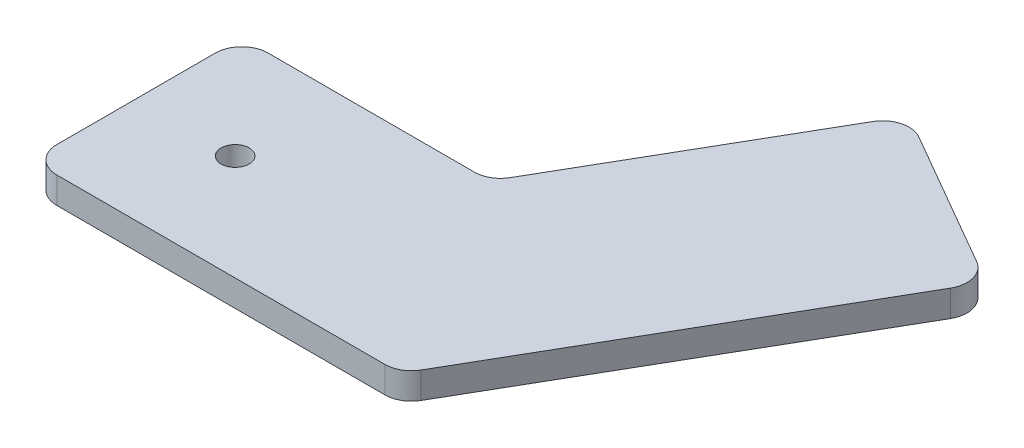
ISO-10303-21;
HEADER;
FILE_DESCRIPTION(('STEP AP214'),'2;1');
FILE_NAME('part.step','',(''),(''),'','','');
FILE_SCHEMA(('AUTOMOTIVE_DESIGN { 1 0 10303 214 1 1 1 1 }'));
ENDSEC;
DATA;
#1=APPLICATION_CONTEXT('core data for automotive mechanical design processes');
#2=APPLICATION_PROTOCOL_DEFINITION('international standard','automotive_design',2000,#1);
#3=PRODUCT_CONTEXT('',#1,'mechanical');
#4=PRODUCT('Part','Part','',(#3));
#5=PRODUCT_RELATED_PRODUCT_CATEGORY('part','',(#4));
#6=PRODUCT_DEFINITION_FORMATION('','',#4);
#7=PRODUCT_DEFINITION_CONTEXT('part definition',#1,'design');
#8=PRODUCT_DEFINITION('design','',#6,#7);
#9=PRODUCT_DEFINITION_SHAPE('','',#8);
#10=(LENGTH_UNIT() NAMED_UNIT(*) SI_UNIT(.MILLI.,.METRE.));
#11=(NAMED_UNIT(*) PLANE_ANGLE_UNIT() SI_UNIT($,.RADIAN.));
#12=(NAMED_UNIT(*) SI_UNIT($,.STERADIAN.) SOLID_ANGLE_UNIT());
#13=UNCERTAINTY_MEASURE_WITH_UNIT(LENGTH_MEASURE(1.E-05),#10,'distance_accuracy_value','');
#14=(GEOMETRIC_REPRESENTATION_CONTEXT(3) GLOBAL_UNCERTAINTY_ASSIGNED_CONTEXT((#13)) GLOBAL_UNIT_ASSIGNED_CONTEXT((#10,
#11,#12)) REPRESENTATION_CONTEXT('',''));
#15=CARTESIAN_POINT('',(0.,0.,0.));
#16=DIRECTION('',(0.,0.,1.));
#17=DIRECTION('',(1.,0.,0.));
#18=AXIS2_PLACEMENT_3D('',#15,#16,#17);
#19=CARTESIAN_POINT('',(0.,6.35,0.));
#20=DIRECTION('',(0.,1.,0.));
#21=DIRECTION('',(0.,0.,1.));
#22=AXIS2_PLACEMENT_3D('',#19,#20,#21);
#23=PLANE('',#22);
#24=CARTESIAN_POINT('',(-65.0875,6.35,-25.4));
#25=DIRECTION('',(0.,1.,0.));
#26=DIRECTION('',(0.,0.,1.));
#27=AXIS2_PLACEMENT_3D('',#24,#25,#26);
#28=CIRCLE('',#27,3.3655);
#29=CARTESIAN_POINT('',(-65.0875,6.35,-22.0345));
#30=VERTEX_POINT('',#29);
#31=EDGE_CURVE('E167',#30,#30,#28,.F.);
#32=ORIENTED_EDGE('',*,*,#31,.T.);
#33=EDGE_LOOP('',(#32));
#34=FACE_BOUND('',#33,.T.);
#35=DIRECTION('',(-1.,0.,0.));
#36=VECTOR('',#35,1.);
#37=CARTESIAN_POINT('',(-29.3293936748266,6.35,-50.8));
#38=LINE('',#37,#36);
#39=CARTESIAN_POINT('',(-82.55,6.35,-50.8));
#40=VERTEX_POINT('',#39);
#41=CARTESIAN_POINT('',(-32.9955678841958,6.35,-50.8));
#42=VERTEX_POINT('',#41);
#43=EDGE_CURVE('E117',#40,#42,#38,.F.);
#44=ORIENTED_EDGE('',*,*,#43,.F.);
#45=CARTESIAN_POINT('',(-82.55,6.35,-44.45));
#46=DIRECTION('',(0.,-1.,0.));
#47=DIRECTION('',(0.,0.,-1.));
#48=AXIS2_PLACEMENT_3D('',#45,#46,#47);
#49=CIRCLE('',#48,6.35);
#50=CARTESIAN_POINT('',(-88.9,6.35,-44.45));
#51=VERTEX_POINT('',#50);
#52=EDGE_CURVE('E20',#51,#40,#49,.T.);
#53=ORIENTED_EDGE('',*,*,#52,.F.);
#54=DIRECTION('',(0.,0.,1.));
#55=VECTOR('',#54,1.);
#56=CARTESIAN_POINT('',(-88.9,6.35,-50.8));
#57=LINE('',#56,#55);
#58=CARTESIAN_POINT('',(-88.9,6.35,-6.35));
#59=VERTEX_POINT('',#58);
#60=EDGE_CURVE('E103',#59,#51,#57,.F.);
#61=ORIENTED_EDGE('',*,*,#60,.F.);
#62=CARTESIAN_POINT('',(-82.55,6.35,-6.35));
#63=DIRECTION('',(0.,-1.,0.));
#64=DIRECTION('',(0.,0.,-1.));
#65=AXIS2_PLACEMENT_3D('',#62,#63,#64);
#66=CIRCLE('',#65,6.35);
#67=CARTESIAN_POINT('',(-82.55,6.35,0.));
#68=VERTEX_POINT('',#67);
#69=EDGE_CURVE('E124',#68,#59,#66,.T.);
#70=ORIENTED_EDGE('',*,*,#69,.F.);
#71=DIRECTION('',(1.,0.,0.));
#72=VECTOR('',#71,1.);
#73=CARTESIAN_POINT('',(-88.9,6.35,0.));
#74=LINE('',#73,#72);
#75=CARTESIAN_POINT('',(-3.66617420935396,6.35,0.));
#76=VERTEX_POINT('',#75);
#77=EDGE_CURVE('E143',#76,#68,#74,.F.);
#78=ORIENTED_EDGE('',*,*,#77,.F.);
#79=CARTESIAN_POINT('',(-3.66617420935396,6.35,-6.35));
#80=DIRECTION('',(0.,-1.,0.));
#81=DIRECTION('',(0.,0.,-1.));
#82=AXIS2_PLACEMENT_3D('',#79,#80,#81);
#83=CIRCLE('',#82,6.35);
#84=CARTESIAN_POINT('',(1.83308710467707,6.35,-3.17499999999987));
#85=VERTEX_POINT('',#84);
#86=EDGE_CURVE('E177',#85,#76,#83,.T.);
#87=ORIENTED_EDGE('',*,*,#86,.F.);
#88=DIRECTION('',(0.500000000000017,0.,-0.866025403784429));
#89=VECTOR('',#88,1.);
#90=CARTESIAN_POINT('',(0.,6.35,0.));
#91=LINE('',#90,#89);
#92=CARTESIAN_POINT('',(48.4187500000012,6.35,-83.8637350389712));
#93=VERTEX_POINT('',#92);
#94=EDGE_CURVE('E139',#93,#85,#91,.F.);
#95=ORIENTED_EDGE('',*,*,#94,.F.);
#96=CARTESIAN_POINT('',(42.9194886859716,6.35,-87.0387350389712));
#97=DIRECTION('',(0.,-1.,0.));
#98=DIRECTION('',(0.,0.,-1.));
#99=AXIS2_PLACEMENT_3D('',#96,#97,#98);
#100=CIRCLE('',#99,6.35);
#101=CARTESIAN_POINT('',(46.0944886859704,6.35,-92.5379963529988));
#102=VERTEX_POINT('',#101);
#103=EDGE_CURVE('E175',#102,#93,#100,.T.);
#104=ORIENTED_EDGE('',*,*,#103,.F.);
#105=DIRECTION('',(-0.866025403784429,0.,-0.500000000000017));
#106=VECTOR('',#105,1.);
#107=CARTESIAN_POINT('',(51.59375,6.35,-89.3629963529996));
#108=LINE('',#107,#106);
#109=CARTESIAN_POINT('',(13.0989208017813,6.35,-111.587996353002));
#110=VERTEX_POINT('',#109);
#111=EDGE_CURVE('E135',#110,#102,#108,.F.);
#112=ORIENTED_EDGE('',*,*,#111,.F.);
#113=CARTESIAN_POINT('',(9.92392080178088,6.35,-106.088735038971));
#114=DIRECTION('',(0.,-1.,0.));
#115=DIRECTION('',(0.,0.,-1.));
#116=AXIS2_PLACEMENT_3D('',#113,#114,#115);
#117=CIRCLE('',#116,6.35);
#118=CARTESIAN_POINT('',(4.42465948775104,6.35,-109.263735038971));
#119=VERTEX_POINT('',#118);
#120=EDGE_CURVE('E173',#119,#110,#117,.T.);
#121=ORIENTED_EDGE('',*,*,#120,.F.);
#122=DIRECTION('',(-0.500000000000017,0.,0.866025403784429));
#123=VECTOR('',#122,1.);
#124=CARTESIAN_POINT('',(7.59965948774994,6.35,-114.762996353));
#125=LINE('',#124,#123);
#126=CARTESIAN_POINT('',(-27.4963065701523,6.35,-53.9750000000121));
#127=VERTEX_POINT('',#126);
#128=EDGE_CURVE('E131',#127,#119,#125,.F.);
#129=ORIENTED_EDGE('',*,*,#128,.F.);
#130=CARTESIAN_POINT('',(-32.9955678841958,6.35,-57.15));
#131=DIRECTION('',(0.,1.,0.));
#132=DIRECTION('',(0.,0.,1.));
#133=AXIS2_PLACEMENT_3D('',#130,#131,#132);
#134=CIRCLE('',#133,6.35);
#135=EDGE_CURVE('E130',#127,#42,#134,.F.);
#136=ORIENTED_EDGE('',*,*,#135,.T.);
#137=EDGE_LOOP('',(#44,#53,#61,#70,#78,#87,#95,#104,#112,#121,#129,#136));
#138=FACE_BOUND('',#137,.T.);
#139=ADVANCED_FACE('F17',(#34,#138),#23,.T.);
#140=CARTESIAN_POINT('',(-82.55,14.62786,-44.45));
#141=DIRECTION('',(0.,-1.,0.));
#142=DIRECTION('',(0.,0.,-1.));
#143=AXIS2_PLACEMENT_3D('',#140,#141,#142);
#144=CYLINDRICAL_SURFACE('',#143,6.35);
#145=DIRECTION('',(0.,1.,0.));
#146=VECTOR('',#145,1.);
#147=CARTESIAN_POINT('',(-82.55,0.,-50.8));
#148=LINE('',#147,#146);
#149=CARTESIAN_POINT('',(-82.55,0.,-50.8));
#150=VERTEX_POINT('',#149);
#151=EDGE_CURVE('E170',#150,#40,#148,.T.);
#152=ORIENTED_EDGE('',*,*,#151,.F.);
#153=CARTESIAN_POINT('',(-82.55,0.,-44.45));
#154=DIRECTION('',(0.,-1.,0.));
#155=DIRECTION('',(0.,0.,-1.));
#156=AXIS2_PLACEMENT_3D('',#153,#154,#155);
#157=CIRCLE('',#156,6.35);
#158=CARTESIAN_POINT('',(-88.9,0.,-44.45));
#159=VERTEX_POINT('',#158);
#160=EDGE_CURVE('E123',#150,#159,#157,.F.);
#161=ORIENTED_EDGE('',*,*,#160,.T.);
#162=DIRECTION('',(0.,1.,0.));
#163=VECTOR('',#162,1.);
#164=CARTESIAN_POINT('',(-88.9,0.,-44.45));
#165=LINE('',#164,#163);
#166=EDGE_CURVE('E108',#51,#159,#165,.F.);
#167=ORIENTED_EDGE('',*,*,#166,.F.);
#168=ORIENTED_EDGE('',*,*,#52,.T.);
#169=EDGE_LOOP('',(#152,#161,#167,#168));
#170=FACE_BOUND('',#169,.T.);
#171=ADVANCED_FACE('F122',(#170),#144,.T.);
#172=CARTESIAN_POINT('',(-88.9,0.,-50.8));
#173=DIRECTION('',(-1.,0.,0.));
#174=DIRECTION('',(0.,0.,1.));
#175=AXIS2_PLACEMENT_3D('',#172,#173,#174);
#176=PLANE('',#175);
#177=ORIENTED_EDGE('',*,*,#60,.T.);
#178=ORIENTED_EDGE('',*,*,#166,.T.);
#179=DIRECTION('',(0.,0.,1.));
#180=VECTOR('',#179,1.);
#181=CARTESIAN_POINT('',(-88.9,0.,0.));
#182=LINE('',#181,#180);
#183=CARTESIAN_POINT('',(-88.9,0.,-6.35));
#184=VERTEX_POINT('',#183);
#185=EDGE_CURVE('E165',#159,#184,#182,.T.);
#186=ORIENTED_EDGE('',*,*,#185,.T.);
#187=DIRECTION('',(0.,-1.,0.));
#188=VECTOR('',#187,1.);
#189=CARTESIAN_POINT('',(-88.9,14.62786,-6.35));
#190=LINE('',#189,#188);
#191=EDGE_CURVE('E110',#59,#184,#190,.T.);
#192=ORIENTED_EDGE('',*,*,#191,.F.);
#193=EDGE_LOOP('',(#177,#178,#186,#192));
#194=FACE_BOUND('',#193,.T.);
#195=ADVANCED_FACE('F105',(#194),#176,.T.);
#196=CARTESIAN_POINT('',(-82.55,14.62786,-6.35));
#197=DIRECTION('',(0.,-1.,0.));
#198=DIRECTION('',(0.,0.,-1.));
#199=AXIS2_PLACEMENT_3D('',#196,#197,#198);
#200=CYLINDRICAL_SURFACE('',#199,6.35);
#201=ORIENTED_EDGE('',*,*,#191,.T.);
#202=CARTESIAN_POINT('',(-82.55,0.,-6.35));
#203=DIRECTION('',(0.,-1.,0.));
#204=DIRECTION('',(0.,0.,-1.));
#205=AXIS2_PLACEMENT_3D('',#202,#203,#204);
#206=CIRCLE('',#205,6.35);
#207=CARTESIAN_POINT('',(-82.55,0.,0.));
#208=VERTEX_POINT('',#207);
#209=EDGE_CURVE('E162',#184,#208,#206,.F.);
#210=ORIENTED_EDGE('',*,*,#209,.T.);
#211=DIRECTION('',(0.,1.,0.));
#212=VECTOR('',#211,1.);
#213=CARTESIAN_POINT('',(-82.55,0.,0.));
#214=LINE('',#213,#212);
#215=EDGE_CURVE('E144',#68,#208,#214,.F.);
#216=ORIENTED_EDGE('',*,*,#215,.F.);
#217=ORIENTED_EDGE('',*,*,#69,.T.);
#218=EDGE_LOOP('',(#201,#210,#216,#217));
#219=FACE_BOUND('',#218,.T.);
#220=ADVANCED_FACE('F241',(#219),#200,.T.);
#221=CARTESIAN_POINT('',(-88.9,0.,0.));
#222=DIRECTION('',(0.,0.,1.));
#223=DIRECTION('',(1.,0.,0.));
#224=AXIS2_PLACEMENT_3D('',#221,#222,#223);
#225=PLANE('',#224);
#226=ORIENTED_EDGE('',*,*,#77,.T.);
#227=ORIENTED_EDGE('',*,*,#215,.T.);
#228=DIRECTION('',(1.,0.,0.));
#229=VECTOR('',#228,1.);
#230=CARTESIAN_POINT('',(0.,0.,0.));
#231=LINE('',#230,#229);
#232=CARTESIAN_POINT('',(-3.66617420935396,0.,0.));
#233=VERTEX_POINT('',#232);
#234=EDGE_CURVE('E161',#208,#233,#231,.T.);
#235=ORIENTED_EDGE('',*,*,#234,.T.);
#236=DIRECTION('',(0.,-1.,0.));
#237=VECTOR('',#236,1.);
#238=CARTESIAN_POINT('',(-3.66617420935396,14.62786,0.));
#239=LINE('',#238,#237);
#240=EDGE_CURVE('E142',#76,#233,#239,.T.);
#241=ORIENTED_EDGE('',*,*,#240,.F.);
#242=EDGE_LOOP('',(#226,#227,#235,#241));
#243=FACE_BOUND('',#242,.T.);
#244=ADVANCED_FACE('F238',(#243),#225,.T.);
#245=CARTESIAN_POINT('',(-3.66617420935396,14.62786,-6.35));
#246=DIRECTION('',(0.,-1.,0.));
#247=DIRECTION('',(0.,0.,-1.));
#248=AXIS2_PLACEMENT_3D('',#245,#246,#247);
#249=CYLINDRICAL_SURFACE('',#248,6.35);
#250=ORIENTED_EDGE('',*,*,#240,.T.);
#251=CARTESIAN_POINT('',(-3.66617420935396,0.,-6.35));
#252=DIRECTION('',(0.,-1.,0.));
#253=DIRECTION('',(0.,0.,-1.));
#254=AXIS2_PLACEMENT_3D('',#251,#252,#253);
#255=CIRCLE('',#254,6.35);
#256=CARTESIAN_POINT('',(1.83308710467728,0.,-3.17499999999976));
#257=VERTEX_POINT('',#256);
#258=EDGE_CURVE('E158',#233,#257,#255,.F.);
#259=ORIENTED_EDGE('',*,*,#258,.T.);
#260=DIRECTION('',(0.,1.,0.));
#261=VECTOR('',#260,1.);
#262=CARTESIAN_POINT('',(1.83308710467704,0.,-3.17499999999982));
#263=LINE('',#262,#261);
#264=EDGE_CURVE('E141',#85,#257,#263,.F.);
#265=ORIENTED_EDGE('',*,*,#264,.F.);
#266=ORIENTED_EDGE('',*,*,#86,.T.);
#267=EDGE_LOOP('',(#250,#259,#265,#266));
#268=FACE_BOUND('',#267,.T.);
#269=ADVANCED_FACE('F236',(#268),#249,.T.);
#270=CARTESIAN_POINT('',(0.,0.,0.));
#271=DIRECTION('',(0.866025403784429,0.,0.500000000000017));
#272=DIRECTION('',(0.500000000000017,0.,-0.866025403784429));
#273=AXIS2_PLACEMENT_3D('',#270,#271,#272);
#274=PLANE('',#273);
#275=ORIENTED_EDGE('',*,*,#94,.T.);
#276=ORIENTED_EDGE('',*,*,#264,.T.);
#277=DIRECTION('',(0.500000000000015,0.,-0.86602540378443));
#278=VECTOR('',#277,1.);
#279=CARTESIAN_POINT('',(1.83308710467622,0.,-3.17499999999746));
#280=LINE('',#279,#278);
#281=CARTESIAN_POINT('',(48.4187500000014,0.,-83.8637350389712));
#282=VERTEX_POINT('',#281);
#283=EDGE_CURVE('E157',#257,#282,#280,.T.);
#284=ORIENTED_EDGE('',*,*,#283,.T.);
#285=DIRECTION('',(0.,-1.,0.));
#286=VECTOR('',#285,1.);
#287=CARTESIAN_POINT('',(48.4187500000021,14.62786,-83.86373503897));
#288=LINE('',#287,#286);
#289=EDGE_CURVE('E138',#93,#282,#288,.T.);
#290=ORIENTED_EDGE('',*,*,#289,.F.);
#291=EDGE_LOOP('',(#275,#276,#284,#290));
#292=FACE_BOUND('',#291,.T.);
#293=ADVANCED_FACE('F234',(#292),#274,.T.);
#294=CARTESIAN_POINT('',(42.9194886859716,14.62786,-87.0387350389712));
#295=DIRECTION('',(0.,-1.,0.));
#296=DIRECTION('',(0.,0.,-1.));
#297=AXIS2_PLACEMENT_3D('',#294,#295,#296);
#298=CYLINDRICAL_SURFACE('',#297,6.35);
#299=ORIENTED_EDGE('',*,*,#289,.T.);
#300=CARTESIAN_POINT('',(42.9194886859716,0.,-87.0387350389712));
#301=DIRECTION('',(0.,-1.,0.));
#302=DIRECTION('',(0.,0.,-1.));
#303=AXIS2_PLACEMENT_3D('',#300,#301,#302);
#304=CIRCLE('',#303,6.35);
#305=CARTESIAN_POINT('',(46.0944886859729,0.,-92.5379963530054));
#306=VERTEX_POINT('',#305);
#307=EDGE_CURVE('E154',#282,#306,#304,.F.);
#308=ORIENTED_EDGE('',*,*,#307,.T.);
#309=DIRECTION('',(0.,1.,0.));
#310=VECTOR('',#309,1.);
#311=CARTESIAN_POINT('',(46.094488685971,0.,-92.5379963529985));
#312=LINE('',#311,#310);
#313=EDGE_CURVE('E137',#102,#306,#312,.F.);
#314=ORIENTED_EDGE('',*,*,#313,.F.);
#315=ORIENTED_EDGE('',*,*,#103,.T.);
#316=EDGE_LOOP('',(#299,#308,#314,#315));
#317=FACE_BOUND('',#316,.T.);
#318=ADVANCED_FACE('F230',(#317),#298,.T.);
#319=CARTESIAN_POINT('',(51.59375,0.,-89.3629963529996));
#320=DIRECTION('',(0.500000000000017,0.,-0.866025403784429));
#321=DIRECTION('',(-0.866025403784429,0.,-0.500000000000017));
#322=AXIS2_PLACEMENT_3D('',#319,#320,#321);
#323=PLANE('',#322);
#324=DIRECTION('',(-0.866025403784612,0.,-0.499999999999699));
#325=VECTOR('',#324,1.);
#326=CARTESIAN_POINT('',(46.094488685997,0.,-92.5379963529996));
#327=LINE('',#326,#325);
#328=CARTESIAN_POINT('',(13.0989208017802,0.,-111.587996353002));
#329=VERTEX_POINT('',#328);
#330=EDGE_CURVE('E153',#306,#329,#327,.T.);
#331=ORIENTED_EDGE('',*,*,#330,.T.);
#332=DIRECTION('',(0.,-1.,0.));
#333=VECTOR('',#332,1.);
#334=CARTESIAN_POINT('',(13.0989208017821,14.62786,-111.587996353002));
#335=LINE('',#334,#333);
#336=EDGE_CURVE('E134',#110,#329,#335,.T.);
#337=ORIENTED_EDGE('',*,*,#336,.F.);
#338=ORIENTED_EDGE('',*,*,#111,.T.);
#339=ORIENTED_EDGE('',*,*,#313,.T.);
#340=EDGE_LOOP('',(#331,#337,#338,#339));
#341=FACE_BOUND('',#340,.T.);
#342=ADVANCED_FACE('F224',(#341),#323,.T.);
#343=CARTESIAN_POINT('',(9.92392080178088,14.62786,-106.088735038971));
#344=DIRECTION('',(0.,-1.,0.));
#345=DIRECTION('',(0.,0.,-1.));
#346=AXIS2_PLACEMENT_3D('',#343,#344,#345);
#347=CYLINDRICAL_SURFACE('',#346,6.35);
#348=ORIENTED_EDGE('',*,*,#336,.T.);
#349=CARTESIAN_POINT('',(9.92392080178088,0.,-106.088735038971));
#350=DIRECTION('',(0.,-1.,0.));
#351=DIRECTION('',(0.,0.,-1.));
#352=AXIS2_PLACEMENT_3D('',#349,#350,#351);
#353=CIRCLE('',#352,6.35);
#354=CARTESIAN_POINT('',(4.42465948775051,0.,-109.263735038971));
#355=VERTEX_POINT('',#354);
#356=EDGE_CURVE('E150',#329,#355,#353,.F.);
#357=ORIENTED_EDGE('',*,*,#356,.T.);
#358=DIRECTION('',(0.,1.,0.));
#359=VECTOR('',#358,1.);
#360=CARTESIAN_POINT('',(4.42465948775104,0.,-109.263735038971));
#361=LINE('',#360,#359);
#362=EDGE_CURVE('E133',#119,#355,#361,.F.);
#363=ORIENTED_EDGE('',*,*,#362,.F.);
#364=ORIENTED_EDGE('',*,*,#120,.T.);
#365=EDGE_LOOP('',(#348,#357,#363,#364));
#366=FACE_BOUND('',#365,.T.);
#367=ADVANCED_FACE('F220',(#366),#347,.T.);
#368=CARTESIAN_POINT('',(7.59965948774994,0.,-114.762996353));
#369=DIRECTION('',(-0.866025403784429,0.,-0.500000000000017));
#370=DIRECTION('',(-0.500000000000017,0.,0.866025403784429));
#371=AXIS2_PLACEMENT_3D('',#368,#369,#370);
#372=PLANE('',#371);
#373=ORIENTED_EDGE('',*,*,#128,.T.);
#374=ORIENTED_EDGE('',*,*,#362,.T.);
#375=DIRECTION('',(-0.500000000000032,0.,0.86602540378442));
#376=VECTOR('',#375,1.);
#377=CARTESIAN_POINT('',(4.42465948774994,0.,-109.263735038971));
#378=LINE('',#377,#376);
#379=CARTESIAN_POINT('',(-27.4963065701534,0.,-53.9750000000126));
#380=VERTEX_POINT('',#379);
#381=EDGE_CURVE('E149',#355,#380,#378,.T.);
#382=ORIENTED_EDGE('',*,*,#381,.T.);
#383=DIRECTION('',(0.,1.,0.));
#384=VECTOR('',#383,1.);
#385=CARTESIAN_POINT('',(-27.496306570148,-8.27786,-53.9750000000288));
#386=LINE('',#385,#384);
#387=EDGE_CURVE('E172',#380,#127,#386,.T.);
#388=ORIENTED_EDGE('',*,*,#387,.T.);
#389=EDGE_LOOP('',(#373,#374,#382,#388));
#390=FACE_BOUND('',#389,.T.);
#391=ADVANCED_FACE('F214',(#390),#372,.T.);
#392=CARTESIAN_POINT('',(-32.9955678841958,-8.27786,-57.15));
#393=DIRECTION('',(0.,1.,0.));
#394=DIRECTION('',(0.,0.,1.));
#395=AXIS2_PLACEMENT_3D('',#392,#393,#394);
#396=CYLINDRICAL_SURFACE('',#395,6.35);
#397=ORIENTED_EDGE('',*,*,#387,.F.);
#398=CARTESIAN_POINT('',(-32.9955678841958,0.,-57.15));
#399=DIRECTION('',(0.,1.,0.));
#400=DIRECTION('',(0.,0.,1.));
#401=AXIS2_PLACEMENT_3D('',#398,#399,#400);
#402=CIRCLE('',#401,6.35);
#403=CARTESIAN_POINT('',(-32.9955678841958,0.,-50.8));
#404=VERTEX_POINT('',#403);
#405=EDGE_CURVE('E146',#380,#404,#402,.F.);
#406=ORIENTED_EDGE('',*,*,#405,.T.);
#407=DIRECTION('',(0.,1.,0.));
#408=VECTOR('',#407,1.);
#409=CARTESIAN_POINT('',(-32.9955678841958,0.,-50.8));
#410=LINE('',#409,#408);
#411=EDGE_CURVE('E35',#42,#404,#410,.F.);
#412=ORIENTED_EDGE('',*,*,#411,.F.);
#413=ORIENTED_EDGE('',*,*,#135,.F.);
#414=EDGE_LOOP('',(#397,#406,#412,#413));
#415=FACE_BOUND('',#414,.T.);
#416=ADVANCED_FACE('F211',(#415),#396,.F.);
#417=CARTESIAN_POINT('',(-29.3293936748266,0.,-50.8));
#418=DIRECTION('',(0.,0.,-1.));
#419=DIRECTION('',(-1.,0.,0.));
#420=AXIS2_PLACEMENT_3D('',#417,#418,#419);
#421=PLANE('',#420);
#422=DIRECTION('',(1.,0.,0.));
#423=VECTOR('',#422,1.);
#424=CARTESIAN_POINT('',(0.,0.,-50.8));
#425=LINE('',#424,#423);
#426=EDGE_CURVE('E26',#404,#150,#425,.F.);
#427=ORIENTED_EDGE('',*,*,#426,.T.);
#428=ORIENTED_EDGE('',*,*,#151,.T.);
#429=ORIENTED_EDGE('',*,*,#43,.T.);
#430=ORIENTED_EDGE('',*,*,#411,.T.);
#431=EDGE_LOOP('',(#427,#428,#429,#430));
#432=FACE_BOUND('',#431,.T.);
#433=ADVANCED_FACE('F205',(#432),#421,.T.);
#434=CARTESIAN_POINT('',(-65.0875,6.35,-25.4));
#435=DIRECTION('',(0.,1.,0.));
#436=DIRECTION('',(0.,0.,1.));
#437=AXIS2_PLACEMENT_3D('',#434,#435,#436);
#438=CYLINDRICAL_SURFACE('',#437,3.3655);
#439=ORIENTED_EDGE('',*,*,#31,.F.);
#440=EDGE_LOOP('',(#439));
#441=FACE_BOUND('',#440,.T.);
#442=CARTESIAN_POINT('',(-65.0875,0.,-25.4));
#443=DIRECTION('',(0.,1.,0.));
#444=DIRECTION('',(0.,0.,1.));
#445=AXIS2_PLACEMENT_3D('',#442,#443,#444);
#446=CIRCLE('',#445,3.3655);
#447=CARTESIAN_POINT('',(-65.0875,0.,-22.0345));
#448=VERTEX_POINT('',#447);
#449=EDGE_CURVE('E11',#448,#448,#446,.F.);
#450=ORIENTED_EDGE('',*,*,#449,.T.);
#451=EDGE_LOOP('',(#450));
#452=FACE_BOUND('',#451,.T.);
#453=ADVANCED_FACE('F252',(#441,#452),#438,.F.);
#454=CARTESIAN_POINT('',(0.,0.,0.));
#455=DIRECTION('',(0.,1.,0.));
#456=DIRECTION('',(0.,0.,1.));
#457=AXIS2_PLACEMENT_3D('',#454,#455,#456);
#458=PLANE('',#457);
#459=ORIENTED_EDGE('',*,*,#449,.F.);
#460=EDGE_LOOP('',(#459));
#461=FACE_BOUND('',#460,.T.);
#462=ORIENTED_EDGE('',*,*,#405,.F.);
#463=ORIENTED_EDGE('',*,*,#381,.F.);
#464=ORIENTED_EDGE('',*,*,#356,.F.);
#465=ORIENTED_EDGE('',*,*,#330,.F.);
#466=ORIENTED_EDGE('',*,*,#307,.F.);
#467=ORIENTED_EDGE('',*,*,#283,.F.);
#468=ORIENTED_EDGE('',*,*,#258,.F.);
#469=ORIENTED_EDGE('',*,*,#234,.F.);
#470=ORIENTED_EDGE('',*,*,#209,.F.);
#471=ORIENTED_EDGE('',*,*,#185,.F.);
#472=ORIENTED_EDGE('',*,*,#160,.F.);
#473=ORIENTED_EDGE('',*,*,#426,.F.);
#474=EDGE_LOOP('',(#462,#463,#464,#465,#466,#467,#468,#469,#470,#471,#472,#473));
#475=FACE_BOUND('',#474,.T.);
#476=ADVANCED_FACE('F208',(#461,#475),#458,.F.);
#477=CLOSED_SHELL('',(#139,#171,#195,#220,#244,#269,#293,#318,#342,#367,#391,#416,#433,#453,#476));
#478=MANIFOLD_SOLID_BREP('B1',#477);
#479=ADVANCED_BREP_SHAPE_REPRESENTATION('',(#18,#478),#14);
#480=SHAPE_DEFINITION_REPRESENTATION(#9,#479);
ENDSEC;
END-ISO-10303-21;
